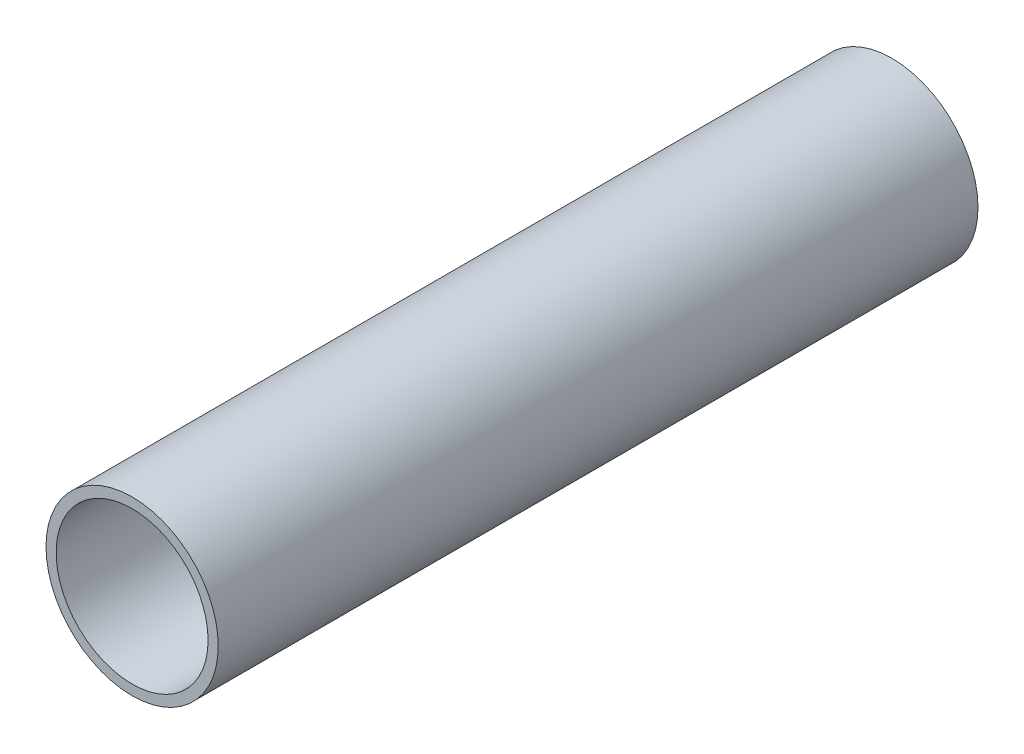
ISO-10303-21;
HEADER;
FILE_DESCRIPTION(('STEP AP214'),'2;1');
FILE_NAME('part.step','',(''),(''),'','','');
FILE_SCHEMA(('AUTOMOTIVE_DESIGN { 1 0 10303 214 1 1 1 1 }'));
ENDSEC;
DATA;
#1=APPLICATION_CONTEXT('core data for automotive mechanical design processes');
#2=APPLICATION_PROTOCOL_DEFINITION('international standard','automotive_design',2000,#1);
#3=PRODUCT_CONTEXT('',#1,'mechanical');
#4=PRODUCT('Part','Part','',(#3));
#5=PRODUCT_RELATED_PRODUCT_CATEGORY('part','',(#4));
#6=PRODUCT_DEFINITION_FORMATION('','',#4);
#7=PRODUCT_DEFINITION_CONTEXT('part definition',#1,'design');
#8=PRODUCT_DEFINITION('design','',#6,#7);
#9=PRODUCT_DEFINITION_SHAPE('','',#8);
#10=(LENGTH_UNIT() NAMED_UNIT(*) SI_UNIT(.MILLI.,.METRE.));
#11=(NAMED_UNIT(*) PLANE_ANGLE_UNIT() SI_UNIT($,.RADIAN.));
#12=(NAMED_UNIT(*) SI_UNIT($,.STERADIAN.) SOLID_ANGLE_UNIT());
#13=UNCERTAINTY_MEASURE_WITH_UNIT(LENGTH_MEASURE(1.E-05),#10,'distance_accuracy_value','');
#14=(GEOMETRIC_REPRESENTATION_CONTEXT(3) GLOBAL_UNCERTAINTY_ASSIGNED_CONTEXT((#13)) GLOBAL_UNIT_ASSIGNED_CONTEXT((#10,
#11,#12)) REPRESENTATION_CONTEXT('',''));
#15=CARTESIAN_POINT('',(0.,0.,0.));
#16=DIRECTION('',(0.,0.,1.));
#17=DIRECTION('',(1.,0.,0.));
#18=AXIS2_PLACEMENT_3D('',#15,#16,#17);
#19=CARTESIAN_POINT('',(0.,0.,300.));
#20=DIRECTION('',(0.,0.,1.));
#21=DIRECTION('',(1.,0.,0.));
#22=AXIS2_PLACEMENT_3D('',#19,#20,#21);
#23=PLANE('',#22);
#24=CARTESIAN_POINT('',(0.,0.,300.));
#25=DIRECTION('',(0.,0.,1.));
#26=DIRECTION('',(1.,0.,0.));
#27=AXIS2_PLACEMENT_3D('',#24,#25,#26);
#28=CIRCLE('',#27,34.);
#29=CARTESIAN_POINT('',(34.,0.,300.));
#30=VERTEX_POINT('',#29);
#31=EDGE_CURVE('E10',#30,#30,#28,.T.);
#32=ORIENTED_EDGE('',*,*,#31,.T.);
#33=EDGE_LOOP('',(#32));
#34=FACE_BOUND('',#33,.T.);
#35=CARTESIAN_POINT('',(0.,0.,300.));
#36=DIRECTION('',(0.,0.,1.));
#37=DIRECTION('',(1.,0.,0.));
#38=AXIS2_PLACEMENT_3D('',#35,#36,#37);
#39=CIRCLE('',#38,30.);
#40=CARTESIAN_POINT('',(30.,0.,300.));
#41=VERTEX_POINT('',#40);
#42=EDGE_CURVE('E46',#41,#41,#39,.T.);
#43=ORIENTED_EDGE('',*,*,#42,.F.);
#44=EDGE_LOOP('',(#43));
#45=FACE_BOUND('',#44,.T.);
#46=ADVANCED_FACE('F35',(#34,#45),#23,.T.);
#47=CARTESIAN_POINT('',(0.,0.,0.));
#48=DIRECTION('',(0.,0.,1.));
#49=DIRECTION('',(1.,0.,0.));
#50=AXIS2_PLACEMENT_3D('',#47,#48,#49);
#51=PLANE('',#50);
#52=CARTESIAN_POINT('',(0.,0.,0.));
#53=DIRECTION('',(0.,0.,1.));
#54=DIRECTION('',(1.,0.,0.));
#55=AXIS2_PLACEMENT_3D('',#52,#53,#54);
#56=CIRCLE('',#55,34.);
#57=CARTESIAN_POINT('',(34.,0.,0.));
#58=VERTEX_POINT('',#57);
#59=EDGE_CURVE('E39',#58,#58,#56,.T.);
#60=ORIENTED_EDGE('',*,*,#59,.F.);
#61=EDGE_LOOP('',(#60));
#62=FACE_BOUND('',#61,.T.);
#63=CARTESIAN_POINT('',(0.,0.,0.));
#64=DIRECTION('',(0.,0.,1.));
#65=DIRECTION('',(1.,0.,0.));
#66=AXIS2_PLACEMENT_3D('',#63,#64,#65);
#67=CIRCLE('',#66,30.);
#68=CARTESIAN_POINT('',(30.,0.,0.));
#69=VERTEX_POINT('',#68);
#70=EDGE_CURVE('E48',#69,#69,#67,.T.);
#71=ORIENTED_EDGE('',*,*,#70,.T.);
#72=EDGE_LOOP('',(#71));
#73=FACE_BOUND('',#72,.T.);
#74=ADVANCED_FACE('F58',(#62,#73),#51,.F.);
#75=CARTESIAN_POINT('',(0.,0.,300.));
#76=DIRECTION('',(0.,0.,-1.));
#77=DIRECTION('',(-1.,0.,0.));
#78=AXIS2_PLACEMENT_3D('',#75,#76,#77);
#79=CYLINDRICAL_SURFACE('',#78,34.);
#80=ORIENTED_EDGE('',*,*,#31,.F.);
#81=EDGE_LOOP('',(#80));
#82=FACE_BOUND('',#81,.T.);
#83=ORIENTED_EDGE('',*,*,#59,.T.);
#84=EDGE_LOOP('',(#83));
#85=FACE_BOUND('',#84,.T.);
#86=ADVANCED_FACE('F37',(#82,#85),#79,.T.);
#87=CARTESIAN_POINT('',(0.,0.,300.));
#88=DIRECTION('',(0.,0.,-1.));
#89=DIRECTION('',(-1.,0.,0.));
#90=AXIS2_PLACEMENT_3D('',#87,#88,#89);
#91=CYLINDRICAL_SURFACE('',#90,30.);
#92=ORIENTED_EDGE('',*,*,#42,.T.);
#93=EDGE_LOOP('',(#92));
#94=FACE_BOUND('',#93,.T.);
#95=ORIENTED_EDGE('',*,*,#70,.F.);
#96=EDGE_LOOP('',(#95));
#97=FACE_BOUND('',#96,.T.);
#98=ADVANCED_FACE('F54',(#94,#97),#91,.F.);
#99=CLOSED_SHELL('',(#46,#74,#86,#98));
#100=MANIFOLD_SOLID_BREP('B2',#99);
#101=ADVANCED_BREP_SHAPE_REPRESENTATION('',(#18,#100),#14);
#102=SHAPE_DEFINITION_REPRESENTATION(#9,#101);
ENDSEC;
END-ISO-10303-21;
